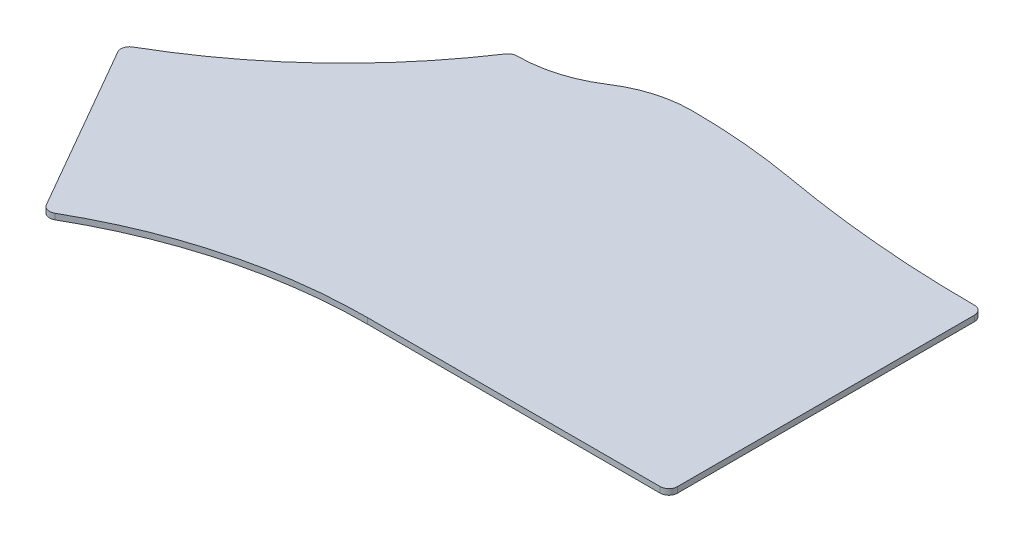
ISO-10303-21;
HEADER;
FILE_DESCRIPTION(('STEP AP214'),'2;1');
FILE_NAME('part.step','',(''),(''),'','','');
FILE_SCHEMA(('AUTOMOTIVE_DESIGN { 1 0 10303 214 1 1 1 1 }'));
ENDSEC;
DATA;
#1=APPLICATION_CONTEXT('core data for automotive mechanical design processes');
#2=APPLICATION_PROTOCOL_DEFINITION('international standard','automotive_design',2000,#1);
#3=PRODUCT_CONTEXT('',#1,'mechanical');
#4=PRODUCT('Part','Part','',(#3));
#5=PRODUCT_RELATED_PRODUCT_CATEGORY('part','',(#4));
#6=PRODUCT_DEFINITION_FORMATION('','',#4);
#7=PRODUCT_DEFINITION_CONTEXT('part definition',#1,'design');
#8=PRODUCT_DEFINITION('design','',#6,#7);
#9=PRODUCT_DEFINITION_SHAPE('','',#8);
#10=(LENGTH_UNIT() NAMED_UNIT(*) SI_UNIT(.MILLI.,.METRE.));
#11=(NAMED_UNIT(*) PLANE_ANGLE_UNIT() SI_UNIT($,.RADIAN.));
#12=(NAMED_UNIT(*) SI_UNIT($,.STERADIAN.) SOLID_ANGLE_UNIT());
#13=UNCERTAINTY_MEASURE_WITH_UNIT(LENGTH_MEASURE(1.E-05),#10,'distance_accuracy_value','');
#14=(GEOMETRIC_REPRESENTATION_CONTEXT(3) GLOBAL_UNCERTAINTY_ASSIGNED_CONTEXT((#13)) GLOBAL_UNIT_ASSIGNED_CONTEXT((#10,
#11,#12)) REPRESENTATION_CONTEXT('',''));
#15=CARTESIAN_POINT('',(0.,0.,0.));
#16=DIRECTION('',(0.,0.,1.));
#17=DIRECTION('',(1.,0.,0.));
#18=AXIS2_PLACEMENT_3D('',#15,#16,#17);
#19=CARTESIAN_POINT('',(47.,-2.,180.671296296294));
#20=DIRECTION('',(0.,1.,0.));
#21=DIRECTION('',(0.,0.,1.));
#22=AXIS2_PLACEMENT_3D('',#19,#20,#21);
#23=CYLINDRICAL_SURFACE('',#22,215.671296296294);
#24=CARTESIAN_POINT('',(47.,0.,180.671296296294));
#25=DIRECTION('',(0.,1.,0.));
#26=DIRECTION('',(0.,0.,-1.));
#27=AXIS2_PLACEMENT_3D('',#24,#25,#26);
#28=CIRCLE('',#27,215.671296296294);
#29=CARTESIAN_POINT('',(84.6508496926642,0.,-31.6881197029601));
#30=VERTEX_POINT('',#29);
#31=CARTESIAN_POINT('',(47.0000000000004,0.,-35.0000000000001));
#32=VERTEX_POINT('',#31);
#33=EDGE_CURVE('E184',#30,#32,#28,.T.);
#34=ORIENTED_EDGE('',*,*,#33,.F.);
#35=DIRECTION('',(0.,1.,0.));
#36=VECTOR('',#35,1.);
#37=CARTESIAN_POINT('',(84.6508496926642,-2.,-31.6881197029601));
#38=LINE('',#37,#36);
#39=CARTESIAN_POINT('',(84.6508496926642,-2.,-31.6881197029601));
#40=VERTEX_POINT('',#39);
#41=EDGE_CURVE('E11',#40,#30,#38,.T.);
#42=ORIENTED_EDGE('',*,*,#41,.F.);
#43=CARTESIAN_POINT('',(47.,-2.,180.671296296294));
#44=DIRECTION('',(0.,1.,0.));
#45=DIRECTION('',(0.,0.,-1.));
#46=AXIS2_PLACEMENT_3D('',#43,#44,#45);
#47=CIRCLE('',#46,215.671296296294);
#48=CARTESIAN_POINT('',(47.0000000000004,-2.,-35.0000000000001));
#49=VERTEX_POINT('',#48);
#50=EDGE_CURVE('E236',#40,#49,#47,.T.);
#51=ORIENTED_EDGE('',*,*,#50,.T.);
#52=DIRECTION('',(0.,1.,0.));
#53=VECTOR('',#52,1.);
#54=CARTESIAN_POINT('',(47.0000000000004,-2.,-35.0000000000001));
#55=LINE('',#54,#53);
#56=EDGE_CURVE('E48',#49,#32,#55,.T.);
#57=ORIENTED_EDGE('',*,*,#56,.T.);
#58=EDGE_LOOP('',(#34,#42,#51,#57));
#59=FACE_BOUND('',#58,.T.);
#60=ADVANCED_FACE('F45',(#59),#23,.T.);
#61=CARTESIAN_POINT('',(155.,-2.,-428.473440545807));
#62=DIRECTION('',(0.,1.,0.));
#63=DIRECTION('',(0.,0.,1.));
#64=AXIS2_PLACEMENT_3D('',#61,#62,#63);
#65=CYLINDRICAL_SURFACE('',#64,402.973440545807);
#66=CARTESIAN_POINT('',(155.,0.,-428.473440545807));
#67=DIRECTION('',(0.,-1.,0.));
#68=DIRECTION('',(0.,0.,1.));
#69=AXIS2_PLACEMENT_3D('',#66,#67,#68);
#70=CIRCLE('',#69,402.973440545807);
#71=CARTESIAN_POINT('',(155.,0.,-25.4999999999999));
#72=VERTEX_POINT('',#71);
#73=EDGE_CURVE('E233',#72,#30,#70,.T.);
#74=ORIENTED_EDGE('',*,*,#73,.F.);
#75=DIRECTION('',(0.,1.,0.));
#76=VECTOR('',#75,1.);
#77=CARTESIAN_POINT('',(155.,-2.,-25.4999999999999));
#78=LINE('',#77,#76);
#79=CARTESIAN_POINT('',(155.,-2.,-25.4999999999999));
#80=VERTEX_POINT('',#79);
#81=EDGE_CURVE('E55',#80,#72,#78,.T.);
#82=ORIENTED_EDGE('',*,*,#81,.F.);
#83=CARTESIAN_POINT('',(155.,-2.,-428.473440545807));
#84=DIRECTION('',(0.,-1.,0.));
#85=DIRECTION('',(0.,0.,1.));
#86=AXIS2_PLACEMENT_3D('',#83,#84,#85);
#87=CIRCLE('',#86,402.973440545807);
#88=EDGE_CURVE('E170',#80,#40,#87,.T.);
#89=ORIENTED_EDGE('',*,*,#88,.T.);
#90=ORIENTED_EDGE('',*,*,#41,.T.);
#91=EDGE_LOOP('',(#74,#82,#89,#90));
#92=FACE_BOUND('',#91,.T.);
#93=ADVANCED_FACE('F272',(#92),#65,.F.);
#94=CARTESIAN_POINT('',(155.,-2.,-22.4999999999998));
#95=DIRECTION('',(0.,1.,0.));
#96=DIRECTION('',(0.,0.,1.));
#97=AXIS2_PLACEMENT_3D('',#94,#95,#96);
#98=CYLINDRICAL_SURFACE('',#97,3.00000000000016);
#99=CARTESIAN_POINT('',(155.,0.,-22.4999999999998));
#100=DIRECTION('',(0.,1.,0.));
#101=DIRECTION('',(0.,0.,1.));
#102=AXIS2_PLACEMENT_3D('',#99,#100,#101);
#103=CIRCLE('',#102,3.00000000000016);
#104=CARTESIAN_POINT('',(158.,0.,-22.4999999999998));
#105=VERTEX_POINT('',#104);
#106=EDGE_CURVE('E156',#105,#72,#103,.T.);
#107=ORIENTED_EDGE('',*,*,#106,.F.);
#108=DIRECTION('',(0.,1.,0.));
#109=VECTOR('',#108,1.);
#110=CARTESIAN_POINT('',(158.,-2.,-22.4999999999998));
#111=LINE('',#110,#109);
#112=CARTESIAN_POINT('',(158.,-2.,-22.4999999999998));
#113=VERTEX_POINT('',#112);
#114=EDGE_CURVE('E151',#113,#105,#111,.T.);
#115=ORIENTED_EDGE('',*,*,#114,.F.);
#116=CARTESIAN_POINT('',(155.,-2.,-22.4999999999998));
#117=DIRECTION('',(0.,1.,0.));
#118=DIRECTION('',(0.,0.,1.));
#119=AXIS2_PLACEMENT_3D('',#116,#117,#118);
#120=CIRCLE('',#119,3.00000000000016);
#121=EDGE_CURVE('E154',#113,#80,#120,.T.);
#122=ORIENTED_EDGE('',*,*,#121,.T.);
#123=ORIENTED_EDGE('',*,*,#81,.T.);
#124=EDGE_LOOP('',(#107,#115,#122,#123));
#125=FACE_BOUND('',#124,.T.);
#126=ADVANCED_FACE('F153',(#125),#98,.T.);
#127=CARTESIAN_POINT('',(158.,-2.,-22.4999999999998));
#128=DIRECTION('',(1.,0.,0.));
#129=DIRECTION('',(0.,0.,-1.));
#130=AXIS2_PLACEMENT_3D('',#127,#128,#129);
#131=PLANE('',#130);
#132=DIRECTION('',(0.,0.,-1.));
#133=VECTOR('',#132,1.);
#134=CARTESIAN_POINT('',(158.,0.,-22.4999999999998));
#135=LINE('',#134,#133);
#136=CARTESIAN_POINT('',(158.,0.,80.9999999999998));
#137=VERTEX_POINT('',#136);
#138=EDGE_CURVE('E228',#137,#105,#135,.T.);
#139=ORIENTED_EDGE('',*,*,#138,.F.);
#140=DIRECTION('',(0.,1.,0.));
#141=VECTOR('',#140,1.);
#142=CARTESIAN_POINT('',(158.,-2.,80.9999999999998));
#143=LINE('',#142,#141);
#144=CARTESIAN_POINT('',(158.,-2.,80.9999999999998));
#145=VERTEX_POINT('',#144);
#146=EDGE_CURVE('E162',#145,#137,#143,.T.);
#147=ORIENTED_EDGE('',*,*,#146,.F.);
#148=DIRECTION('',(0.,0.,-1.));
#149=VECTOR('',#148,1.);
#150=CARTESIAN_POINT('',(158.,-2.,-22.4999999999998));
#151=LINE('',#150,#149);
#152=EDGE_CURVE('E168',#145,#113,#151,.T.);
#153=ORIENTED_EDGE('',*,*,#152,.T.);
#154=ORIENTED_EDGE('',*,*,#114,.T.);
#155=EDGE_LOOP('',(#139,#147,#153,#154));
#156=FACE_BOUND('',#155,.T.);
#157=ADVANCED_FACE('F173',(#156),#131,.T.);
#158=CARTESIAN_POINT('',(155.,-2.,80.9999999999998));
#159=DIRECTION('',(0.,1.,0.));
#160=DIRECTION('',(0.,0.,1.));
#161=AXIS2_PLACEMENT_3D('',#158,#159,#160);
#162=CYLINDRICAL_SURFACE('',#161,3.00000000000017);
#163=CARTESIAN_POINT('',(155.,0.,80.9999999999998));
#164=DIRECTION('',(0.,1.,0.));
#165=DIRECTION('',(0.,0.,1.));
#166=AXIS2_PLACEMENT_3D('',#163,#164,#165);
#167=CIRCLE('',#166,3.00000000000017);
#168=CARTESIAN_POINT('',(154.999999999999,0.,84.));
#169=VERTEX_POINT('',#168);
#170=EDGE_CURVE('E224',#169,#137,#167,.T.);
#171=ORIENTED_EDGE('',*,*,#170,.F.);
#172=DIRECTION('',(0.,1.,0.));
#173=VECTOR('',#172,1.);
#174=CARTESIAN_POINT('',(154.999999999999,-2.,84.));
#175=LINE('',#174,#173);
#176=CARTESIAN_POINT('',(154.999999999999,-2.,84.));
#177=VERTEX_POINT('',#176);
#178=EDGE_CURVE('E242',#177,#169,#175,.T.);
#179=ORIENTED_EDGE('',*,*,#178,.F.);
#180=CARTESIAN_POINT('',(155.,-2.,80.9999999999998));
#181=DIRECTION('',(0.,1.,0.));
#182=DIRECTION('',(0.,0.,1.));
#183=AXIS2_PLACEMENT_3D('',#180,#181,#182);
#184=CIRCLE('',#183,3.00000000000017);
#185=EDGE_CURVE('E175',#177,#145,#184,.T.);
#186=ORIENTED_EDGE('',*,*,#185,.T.);
#187=ORIENTED_EDGE('',*,*,#146,.T.);
#188=EDGE_LOOP('',(#171,#179,#186,#187));
#189=FACE_BOUND('',#188,.T.);
#190=ADVANCED_FACE('F285',(#189),#162,.T.);
#191=CARTESIAN_POINT('',(154.999999999999,-2.,84.));
#192=DIRECTION('',(0.,0.,1.));
#193=DIRECTION('',(1.,0.,0.));
#194=AXIS2_PLACEMENT_3D('',#191,#192,#193);
#195=PLANE('',#194);
#196=DIRECTION('',(1.,0.,0.));
#197=VECTOR('',#196,1.);
#198=CARTESIAN_POINT('',(154.999999999999,0.,84.));
#199=LINE('',#198,#197);
#200=CARTESIAN_POINT('',(53.0504664820005,0.,84.));
#201=VERTEX_POINT('',#200);
#202=EDGE_CURVE('E220',#201,#169,#199,.T.);
#203=ORIENTED_EDGE('',*,*,#202,.F.);
#204=DIRECTION('',(0.,1.,0.));
#205=VECTOR('',#204,1.);
#206=CARTESIAN_POINT('',(53.0504664820005,-2.,84.));
#207=LINE('',#206,#205);
#208=CARTESIAN_POINT('',(53.0504664820005,-2.,84.));
#209=VERTEX_POINT('',#208);
#210=EDGE_CURVE('E245',#209,#201,#207,.T.);
#211=ORIENTED_EDGE('',*,*,#210,.F.);
#212=DIRECTION('',(1.,0.,0.));
#213=VECTOR('',#212,1.);
#214=CARTESIAN_POINT('',(154.999999999999,-2.,84.));
#215=LINE('',#214,#213);
#216=EDGE_CURVE('E178',#209,#177,#215,.T.);
#217=ORIENTED_EDGE('',*,*,#216,.T.);
#218=ORIENTED_EDGE('',*,*,#178,.T.);
#219=EDGE_LOOP('',(#203,#211,#217,#218));
#220=FACE_BOUND('',#219,.T.);
#221=ADVANCED_FACE('F288',(#220),#195,.T.);
#222=CARTESIAN_POINT('',(53.0504664820005,-2.,256.538939218634));
#223=DIRECTION('',(0.,1.,0.));
#224=DIRECTION('',(0.,0.,1.));
#225=AXIS2_PLACEMENT_3D('',#222,#223,#224);
#226=CYLINDRICAL_SURFACE('',#225,172.538939218634);
#227=CARTESIAN_POINT('',(53.0504664820005,0.,256.538939218634));
#228=DIRECTION('',(0.,-1.,0.));
#229=DIRECTION('',(0.,0.,-1.));
#230=AXIS2_PLACEMENT_3D('',#227,#228,#229);
#231=CIRCLE('',#230,172.538939218634);
#232=CARTESIAN_POINT('',(-32.9480567128961,0.,106.959730920862));
#233=VERTEX_POINT('',#232);
#234=EDGE_CURVE('E216',#233,#201,#231,.T.);
#235=ORIENTED_EDGE('',*,*,#234,.F.);
#236=DIRECTION('',(0.,1.,0.));
#237=VECTOR('',#236,1.);
#238=CARTESIAN_POINT('',(-32.9480567128961,-2.,106.959730920862));
#239=LINE('',#238,#237);
#240=CARTESIAN_POINT('',(-32.9480567128961,-2.,106.959730920862));
#241=VERTEX_POINT('',#240);
#242=EDGE_CURVE('E248',#241,#233,#239,.T.);
#243=ORIENTED_EDGE('',*,*,#242,.F.);
#244=CARTESIAN_POINT('',(53.0504664820005,-2.,256.538939218634));
#245=DIRECTION('',(0.,-1.,0.));
#246=DIRECTION('',(0.,0.,-1.));
#247=AXIS2_PLACEMENT_3D('',#244,#245,#246);
#248=CIRCLE('',#247,172.538939218634);
#249=EDGE_CURVE('E479',#241,#209,#248,.T.);
#250=ORIENTED_EDGE('',*,*,#249,.T.);
#251=ORIENTED_EDGE('',*,*,#210,.T.);
#252=EDGE_LOOP('',(#235,#243,#250,#251));
#253=FACE_BOUND('',#252,.T.);
#254=ADVANCED_FACE('F292',(#253),#226,.F.);
#255=CARTESIAN_POINT('',(-34.4433456647876,-2.,104.358940473642));
#256=DIRECTION('',(0.,1.,0.));
#257=DIRECTION('',(0.,0.,1.));
#258=AXIS2_PLACEMENT_3D('',#255,#256,#257);
#259=CYLINDRICAL_SURFACE('',#258,2.99999999999984);
#260=CARTESIAN_POINT('',(-34.4433456647876,0.,104.358940473642));
#261=DIRECTION('',(0.,1.,0.));
#262=DIRECTION('',(0.,0.,1.));
#263=AXIS2_PLACEMENT_3D('',#260,#261,#262);
#264=CIRCLE('',#263,2.99999999999984);
#265=CARTESIAN_POINT('',(-37.0441361120076,0.,105.854229425533));
#266=VERTEX_POINT('',#265);
#267=EDGE_CURVE('E212',#266,#233,#264,.T.);
#268=ORIENTED_EDGE('',*,*,#267,.F.);
#269=DIRECTION('',(0.,1.,0.));
#270=VECTOR('',#269,1.);
#271=CARTESIAN_POINT('',(-37.0441361120076,-2.,105.854229425533));
#272=LINE('',#271,#270);
#273=CARTESIAN_POINT('',(-37.0441361120076,-2.,105.854229425533));
#274=VERTEX_POINT('',#273);
#275=EDGE_CURVE('E251',#274,#266,#272,.T.);
#276=ORIENTED_EDGE('',*,*,#275,.F.);
#277=CARTESIAN_POINT('',(-34.4433456647876,-2.,104.358940473642));
#278=DIRECTION('',(0.,1.,0.));
#279=DIRECTION('',(0.,0.,1.));
#280=AXIS2_PLACEMENT_3D('',#277,#278,#279);
#281=CIRCLE('',#280,2.99999999999984);
#282=EDGE_CURVE('E472',#274,#241,#281,.T.);
#283=ORIENTED_EDGE('',*,*,#282,.T.);
#284=ORIENTED_EDGE('',*,*,#242,.T.);
#285=EDGE_LOOP('',(#268,#276,#283,#284));
#286=FACE_BOUND('',#285,.T.);
#287=ADVANCED_FACE('F296',(#286),#259,.T.);
#288=CARTESIAN_POINT('',(-37.0441361120075,-2.,105.854229425533));
#289=DIRECTION('',(-0.866930149073374,0.,0.498429650630475));
#290=DIRECTION('',(0.498429650630475,0.,0.866930149073374));
#291=AXIS2_PLACEMENT_3D('',#288,#289,#290);
#292=PLANE('',#291);
#293=DIRECTION('',(0.498429650630475,0.,0.866930149073374));
#294=VECTOR('',#293,1.);
#295=CARTESIAN_POINT('',(-37.0441361120075,0.,105.854229425533));
#296=LINE('',#295,#294);
#297=CARTESIAN_POINT('',(-70.6881375295645,0.,47.3364443630804));
#298=VERTEX_POINT('',#297);
#299=EDGE_CURVE('E208',#298,#266,#296,.T.);
#300=ORIENTED_EDGE('',*,*,#299,.F.);
#301=DIRECTION('',(0.,1.,0.));
#302=VECTOR('',#301,1.);
#303=CARTESIAN_POINT('',(-70.6881375295645,-2.,47.3364443630804));
#304=LINE('',#303,#302);
#305=CARTESIAN_POINT('',(-70.6881375295645,-2.,47.3364443630804));
#306=VERTEX_POINT('',#305);
#307=EDGE_CURVE('E254',#306,#298,#304,.T.);
#308=ORIENTED_EDGE('',*,*,#307,.F.);
#309=DIRECTION('',(0.498429650630475,0.,0.866930149073374));
#310=VECTOR('',#309,1.);
#311=CARTESIAN_POINT('',(-37.0441361120075,-2.,105.854229425533));
#312=LINE('',#311,#310);
#313=EDGE_CURVE('E468',#306,#274,#312,.T.);
#314=ORIENTED_EDGE('',*,*,#313,.T.);
#315=ORIENTED_EDGE('',*,*,#275,.T.);
#316=EDGE_LOOP('',(#300,#308,#314,#315));
#317=FACE_BOUND('',#316,.T.);
#318=ADVANCED_FACE('F300',(#317),#292,.T.);
#319=CARTESIAN_POINT('',(-68.0873470823459,-2.,45.8411554111898));
#320=DIRECTION('',(0.,1.,0.));
#321=DIRECTION('',(0.,0.,1.));
#322=AXIS2_PLACEMENT_3D('',#319,#320,#321);
#323=CYLINDRICAL_SURFACE('',#322,2.99999999999828);
#324=CARTESIAN_POINT('',(-68.0873470823459,0.,45.8411554111898));
#325=DIRECTION('',(0.,1.,0.));
#326=DIRECTION('',(0.,0.,-1.));
#327=AXIS2_PLACEMENT_3D('',#324,#325,#326);
#328=CIRCLE('',#327,2.99999999999828);
#329=CARTESIAN_POINT('',(-69.5826360342366,0.,43.2403649639712));
#330=VERTEX_POINT('',#329);
#331=EDGE_CURVE('E204',#330,#298,#328,.T.);
#332=ORIENTED_EDGE('',*,*,#331,.F.);
#333=DIRECTION('',(0.,1.,0.));
#334=VECTOR('',#333,1.);
#335=CARTESIAN_POINT('',(-69.5826360342366,-2.,43.2403649639712));
#336=LINE('',#335,#334);
#337=CARTESIAN_POINT('',(-69.5826360342366,-2.,43.2403649639712));
#338=VERTEX_POINT('',#337);
#339=EDGE_CURVE('E257',#338,#330,#336,.T.);
#340=ORIENTED_EDGE('',*,*,#339,.F.);
#341=CARTESIAN_POINT('',(-68.0873470823459,-2.,45.8411554111898));
#342=DIRECTION('',(0.,1.,0.));
#343=DIRECTION('',(0.,0.,-1.));
#344=AXIS2_PLACEMENT_3D('',#341,#342,#343);
#345=CIRCLE('',#344,2.99999999999828);
#346=EDGE_CURVE('E488',#338,#306,#345,.T.);
#347=ORIENTED_EDGE('',*,*,#346,.T.);
#348=ORIENTED_EDGE('',*,*,#307,.T.);
#349=EDGE_LOOP('',(#332,#340,#347,#348));
#350=FACE_BOUND('',#349,.T.);
#351=ADVANCED_FACE('F304',(#350),#323,.T.);
#352=CARTESIAN_POINT('',(-169.495530699253,-2.,-130.540429490619));
#353=DIRECTION('',(0.,1.,0.));
#354=DIRECTION('',(0.,0.,1.));
#355=AXIS2_PLACEMENT_3D('',#352,#353,#354);
#356=CYLINDRICAL_SURFACE('',#355,200.455359223971);
#357=CARTESIAN_POINT('',(-169.495530699253,0.,-130.540429490619));
#358=DIRECTION('',(0.,-1.,0.));
#359=DIRECTION('',(0.,0.,1.));
#360=AXIS2_PLACEMENT_3D('',#357,#358,#359);
#361=CIRCLE('',#360,200.455359223971);
#362=CARTESIAN_POINT('',(-2.4992538610778,0.,-19.6594366929405));
#363=VERTEX_POINT('',#362);
#364=EDGE_CURVE('E200',#363,#330,#361,.T.);
#365=ORIENTED_EDGE('',*,*,#364,.F.);
#366=DIRECTION('',(0.,1.,0.));
#367=VECTOR('',#366,1.);
#368=CARTESIAN_POINT('',(-2.4992538610778,-2.,-19.6594366929405));
#369=LINE('',#368,#367);
#370=CARTESIAN_POINT('',(-2.4992538610778,-2.,-19.6594366929405));
#371=VERTEX_POINT('',#370);
#372=EDGE_CURVE('E260',#371,#363,#369,.T.);
#373=ORIENTED_EDGE('',*,*,#372,.F.);
#374=CARTESIAN_POINT('',(-169.495530699253,-2.,-130.540429490619));
#375=DIRECTION('',(0.,-1.,0.));
#376=DIRECTION('',(0.,0.,1.));
#377=AXIS2_PLACEMENT_3D('',#374,#375,#376);
#378=CIRCLE('',#377,200.455359223971);
#379=EDGE_CURVE('E461',#371,#338,#378,.T.);
#380=ORIENTED_EDGE('',*,*,#379,.T.);
#381=ORIENTED_EDGE('',*,*,#339,.T.);
#382=EDGE_LOOP('',(#365,#373,#380,#381));
#383=FACE_BOUND('',#382,.T.);
#384=ADVANCED_FACE('F308',(#383),#356,.F.);
#385=CARTESIAN_POINT('',(0.,-2.,-18.));
#386=DIRECTION('',(0.,1.,0.));
#387=DIRECTION('',(0.,0.,1.));
#388=AXIS2_PLACEMENT_3D('',#385,#386,#387);
#389=CYLINDRICAL_SURFACE('',#388,2.99999999999829);
#390=CARTESIAN_POINT('',(0.,0.,-18.));
#391=DIRECTION('',(0.,1.,0.));
#392=DIRECTION('',(0.,0.,-1.));
#393=AXIS2_PLACEMENT_3D('',#390,#391,#392);
#394=CIRCLE('',#393,2.99999999999829);
#395=CARTESIAN_POINT('',(0.,0.,-20.9999999999983));
#396=VERTEX_POINT('',#395);
#397=EDGE_CURVE('E196',#396,#363,#394,.T.);
#398=ORIENTED_EDGE('',*,*,#397,.F.);
#399=DIRECTION('',(0.,1.,0.));
#400=VECTOR('',#399,1.);
#401=CARTESIAN_POINT('',(0.,-2.,-20.9999999999983));
#402=LINE('',#401,#400);
#403=CARTESIAN_POINT('',(0.,-2.,-20.9999999999983));
#404=VERTEX_POINT('',#403);
#405=EDGE_CURVE('E263',#404,#396,#402,.T.);
#406=ORIENTED_EDGE('',*,*,#405,.F.);
#407=CARTESIAN_POINT('',(0.,-2.,-18.));
#408=DIRECTION('',(0.,1.,0.));
#409=DIRECTION('',(0.,0.,-1.));
#410=AXIS2_PLACEMENT_3D('',#407,#408,#409);
#411=CIRCLE('',#410,2.99999999999829);
#412=EDGE_CURVE('E457',#404,#371,#411,.T.);
#413=ORIENTED_EDGE('',*,*,#412,.T.);
#414=ORIENTED_EDGE('',*,*,#372,.T.);
#415=EDGE_LOOP('',(#398,#406,#413,#414));
#416=FACE_BOUND('',#415,.T.);
#417=ADVANCED_FACE('F312',(#416),#389,.T.);
#418=CARTESIAN_POINT('',(-4.35849273339173E-13,-2.,-65.9464285714234));
#419=DIRECTION('',(0.,1.,0.));
#420=DIRECTION('',(0.,0.,1.));
#421=AXIS2_PLACEMENT_3D('',#418,#419,#420);
#422=CYLINDRICAL_SURFACE('',#421,44.9464285714252);
#423=CARTESIAN_POINT('',(-4.35849273339173E-13,0.,-65.9464285714234));
#424=DIRECTION('',(0.,-1.,0.));
#425=DIRECTION('',(0.,0.,1.));
#426=AXIS2_PLACEMENT_3D('',#423,#424,#425);
#427=CIRCLE('',#426,44.9464285714252);
#428=CARTESIAN_POINT('',(24.5943866943867,0.,-28.3259875259868));
#429=VERTEX_POINT('',#428);
#430=EDGE_CURVE('E192',#429,#396,#427,.T.);
#431=ORIENTED_EDGE('',*,*,#430,.F.);
#432=DIRECTION('',(0.,1.,0.));
#433=VECTOR('',#432,1.);
#434=CARTESIAN_POINT('',(24.5943866943867,-2.,-28.3259875259868));
#435=LINE('',#434,#433);
#436=CARTESIAN_POINT('',(24.5943866943867,-2.,-28.3259875259868));
#437=VERTEX_POINT('',#436);
#438=EDGE_CURVE('E265',#437,#429,#435,.T.);
#439=ORIENTED_EDGE('',*,*,#438,.F.);
#440=CARTESIAN_POINT('',(-4.35849273339173E-13,-2.,-65.9464285714234));
#441=DIRECTION('',(0.,-1.,0.));
#442=DIRECTION('',(0.,0.,1.));
#443=AXIS2_PLACEMENT_3D('',#440,#441,#442);
#444=CIRCLE('',#443,44.9464285714252);
#445=EDGE_CURVE('E495',#437,#404,#444,.T.);
#446=ORIENTED_EDGE('',*,*,#445,.T.);
#447=ORIENTED_EDGE('',*,*,#405,.T.);
#448=EDGE_LOOP('',(#431,#439,#446,#447));
#449=FACE_BOUND('',#448,.T.);
#450=ADVANCED_FACE('F316',(#449),#422,.F.);
#451=CARTESIAN_POINT('',(47.0000000000004,-2.,5.94642857142502));
#452=DIRECTION('',(0.,1.,0.));
#453=DIRECTION('',(0.,0.,1.));
#454=AXIS2_PLACEMENT_3D('',#451,#452,#453);
#455=CYLINDRICAL_SURFACE('',#454,40.9464285714252);
#456=CARTESIAN_POINT('',(47.0000000000004,0.,5.94642857142502));
#457=DIRECTION('',(0.,1.,0.));
#458=DIRECTION('',(0.,0.,-1.));
#459=AXIS2_PLACEMENT_3D('',#456,#457,#458);
#460=CIRCLE('',#459,40.9464285714252);
#461=EDGE_CURVE('E188',#32,#429,#460,.T.);
#462=ORIENTED_EDGE('',*,*,#461,.F.);
#463=ORIENTED_EDGE('',*,*,#56,.F.);
#464=CARTESIAN_POINT('',(47.0000000000004,-2.,5.94642857142502));
#465=DIRECTION('',(0.,1.,0.));
#466=DIRECTION('',(0.,0.,-1.));
#467=AXIS2_PLACEMENT_3D('',#464,#465,#466);
#468=CIRCLE('',#467,40.9464285714252);
#469=EDGE_CURVE('E498',#49,#437,#468,.T.);
#470=ORIENTED_EDGE('',*,*,#469,.T.);
#471=ORIENTED_EDGE('',*,*,#438,.T.);
#472=EDGE_LOOP('',(#462,#463,#470,#471));
#473=FACE_BOUND('',#472,.T.);
#474=ADVANCED_FACE('F269',(#473),#455,.T.);
#475=CARTESIAN_POINT('',(47.,-2.,180.671296296294));
#476=DIRECTION('',(0.,-1.,0.));
#477=DIRECTION('',(0.,0.,-1.));
#478=AXIS2_PLACEMENT_3D('',#475,#476,#477);
#479=PLANE('',#478);
#480=ORIENTED_EDGE('',*,*,#50,.F.);
#481=ORIENTED_EDGE('',*,*,#88,.F.);
#482=ORIENTED_EDGE('',*,*,#121,.F.);
#483=ORIENTED_EDGE('',*,*,#152,.F.);
#484=ORIENTED_EDGE('',*,*,#185,.F.);
#485=ORIENTED_EDGE('',*,*,#216,.F.);
#486=ORIENTED_EDGE('',*,*,#249,.F.);
#487=ORIENTED_EDGE('',*,*,#282,.F.);
#488=ORIENTED_EDGE('',*,*,#313,.F.);
#489=ORIENTED_EDGE('',*,*,#346,.F.);
#490=ORIENTED_EDGE('',*,*,#379,.F.);
#491=ORIENTED_EDGE('',*,*,#412,.F.);
#492=ORIENTED_EDGE('',*,*,#445,.F.);
#493=ORIENTED_EDGE('',*,*,#469,.F.);
#494=EDGE_LOOP('',(#480,#481,#482,#483,#484,#485,#486,#487,#488,#489,#490,#491,#492,#493));
#495=FACE_BOUND('',#494,.T.);
#496=ADVANCED_FACE('F166',(#495),#479,.T.);
#497=CARTESIAN_POINT('',(47.,0.,180.671296296294));
#498=DIRECTION('',(0.,-1.,0.));
#499=DIRECTION('',(0.,0.,-1.));
#500=AXIS2_PLACEMENT_3D('',#497,#498,#499);
#501=PLANE('',#500);
#502=ORIENTED_EDGE('',*,*,#33,.T.);
#503=ORIENTED_EDGE('',*,*,#461,.T.);
#504=ORIENTED_EDGE('',*,*,#430,.T.);
#505=ORIENTED_EDGE('',*,*,#397,.T.);
#506=ORIENTED_EDGE('',*,*,#364,.T.);
#507=ORIENTED_EDGE('',*,*,#331,.T.);
#508=ORIENTED_EDGE('',*,*,#299,.T.);
#509=ORIENTED_EDGE('',*,*,#267,.T.);
#510=ORIENTED_EDGE('',*,*,#234,.T.);
#511=ORIENTED_EDGE('',*,*,#202,.T.);
#512=ORIENTED_EDGE('',*,*,#170,.T.);
#513=ORIENTED_EDGE('',*,*,#138,.T.);
#514=ORIENTED_EDGE('',*,*,#106,.T.);
#515=ORIENTED_EDGE('',*,*,#73,.T.);
#516=EDGE_LOOP('',(#502,#503,#504,#505,#506,#507,#508,#509,#510,#511,#512,#513,#514,#515));
#517=FACE_BOUND('',#516,.T.);
#518=ADVANCED_FACE('F271',(#517),#501,.F.);
#519=CLOSED_SHELL('',(#60,#93,#126,#157,#190,#221,#254,#287,#318,#351,#384,#417,#450,#474,#496,#518));
#520=MANIFOLD_SOLID_BREP('B2',#519);
#521=ADVANCED_BREP_SHAPE_REPRESENTATION('',(#18,#520),#14);
#522=SHAPE_DEFINITION_REPRESENTATION(#9,#521);
ENDSEC;
END-ISO-10303-21;
